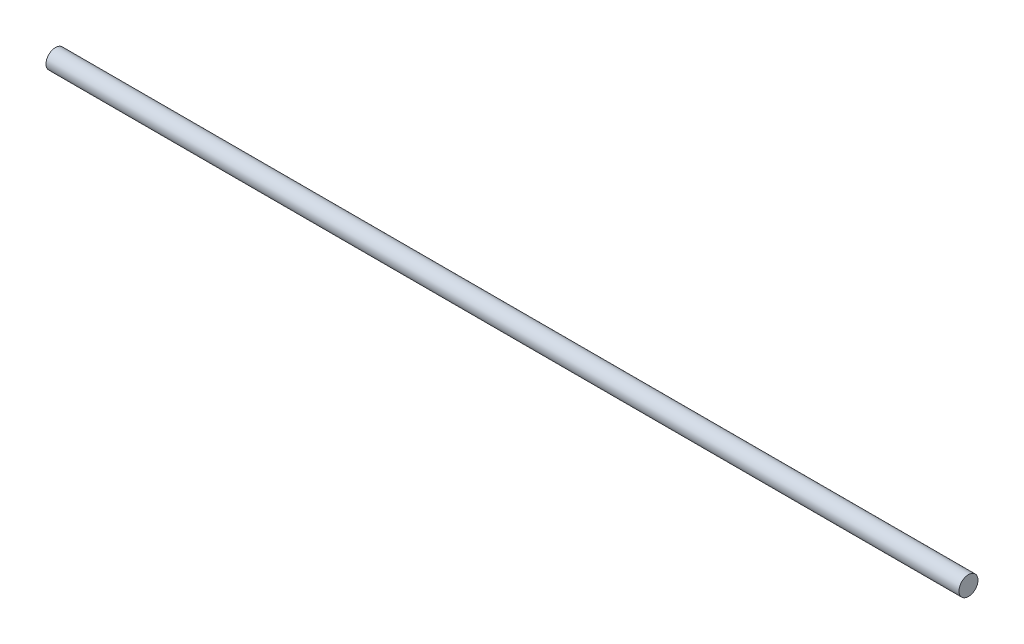
ISO-10303-21;
HEADER;
FILE_DESCRIPTION(('STEP AP214'),'2;1');
FILE_NAME('part.step','',(''),(''),'','','');
FILE_SCHEMA(('AUTOMOTIVE_DESIGN { 1 0 10303 214 1 1 1 1 }'));
ENDSEC;
DATA;
#1=APPLICATION_CONTEXT('core data for automotive mechanical design processes');
#2=APPLICATION_PROTOCOL_DEFINITION('international standard','automotive_design',2000,#1);
#3=PRODUCT_CONTEXT('',#1,'mechanical');
#4=PRODUCT('Part','Part','',(#3));
#5=PRODUCT_RELATED_PRODUCT_CATEGORY('part','',(#4));
#6=PRODUCT_DEFINITION_FORMATION('','',#4);
#7=PRODUCT_DEFINITION_CONTEXT('part definition',#1,'design');
#8=PRODUCT_DEFINITION('design','',#6,#7);
#9=PRODUCT_DEFINITION_SHAPE('','',#8);
#10=(LENGTH_UNIT() NAMED_UNIT(*) SI_UNIT(.MILLI.,.METRE.));
#11=(NAMED_UNIT(*) PLANE_ANGLE_UNIT() SI_UNIT($,.RADIAN.));
#12=(NAMED_UNIT(*) SI_UNIT($,.STERADIAN.) SOLID_ANGLE_UNIT());
#13=UNCERTAINTY_MEASURE_WITH_UNIT(LENGTH_MEASURE(1.E-05),#10,'distance_accuracy_value','');
#14=(GEOMETRIC_REPRESENTATION_CONTEXT(3) GLOBAL_UNCERTAINTY_ASSIGNED_CONTEXT((#13)) GLOBAL_UNIT_ASSIGNED_CONTEXT((#10,
#11,#12)) REPRESENTATION_CONTEXT('',''));
#15=CARTESIAN_POINT('',(0.,0.,0.));
#16=DIRECTION('',(0.,0.,1.));
#17=DIRECTION('',(1.,0.,0.));
#18=AXIS2_PLACEMENT_3D('',#15,#16,#17);
#19=CARTESIAN_POINT('',(-182.88,0.,0.));
#20=DIRECTION('',(1.,0.,0.));
#21=DIRECTION('',(0.,0.,-1.));
#22=AXIS2_PLACEMENT_3D('',#19,#20,#21);
#23=CYLINDRICAL_SURFACE('',#22,3.81);
#24=CARTESIAN_POINT('',(-182.88,0.,0.));
#25=DIRECTION('',(1.,0.,0.));
#26=DIRECTION('',(0.,0.,-1.));
#27=AXIS2_PLACEMENT_3D('',#24,#25,#26);
#28=CIRCLE('',#27,3.81);
#29=CARTESIAN_POINT('',(-182.88,0.,-3.81));
#30=VERTEX_POINT('',#29);
#31=EDGE_CURVE('E10',#30,#30,#28,.T.);
#32=ORIENTED_EDGE('',*,*,#31,.T.);
#33=EDGE_LOOP('',(#32));
#34=FACE_BOUND('',#33,.T.);
#35=CARTESIAN_POINT('',(182.88,0.,0.));
#36=DIRECTION('',(1.,0.,0.));
#37=DIRECTION('',(0.,0.,-1.));
#38=AXIS2_PLACEMENT_3D('',#35,#36,#37);
#39=CIRCLE('',#38,3.81);
#40=CARTESIAN_POINT('',(182.88,0.,-3.81));
#41=VERTEX_POINT('',#40);
#42=EDGE_CURVE('E36',#41,#41,#39,.T.);
#43=ORIENTED_EDGE('',*,*,#42,.F.);
#44=EDGE_LOOP('',(#43));
#45=FACE_BOUND('',#44,.T.);
#46=ADVANCED_FACE('F30',(#34,#45),#23,.T.);
#47=CARTESIAN_POINT('',(-182.88,0.,0.));
#48=DIRECTION('',(1.,0.,0.));
#49=DIRECTION('',(0.,0.,-1.));
#50=AXIS2_PLACEMENT_3D('',#47,#48,#49);
#51=PLANE('',#50);
#52=ORIENTED_EDGE('',*,*,#31,.F.);
#53=EDGE_LOOP('',(#52));
#54=FACE_BOUND('',#53,.T.);
#55=ADVANCED_FACE('F45',(#54),#51,.F.);
#56=CARTESIAN_POINT('',(182.88,0.,0.));
#57=DIRECTION('',(1.,0.,0.));
#58=DIRECTION('',(0.,0.,-1.));
#59=AXIS2_PLACEMENT_3D('',#56,#57,#58);
#60=PLANE('',#59);
#61=ORIENTED_EDGE('',*,*,#42,.T.);
#62=EDGE_LOOP('',(#61));
#63=FACE_BOUND('',#62,.T.);
#64=ADVANCED_FACE('F42',(#63),#60,.T.);
#65=CLOSED_SHELL('',(#46,#55,#64));
#66=MANIFOLD_SOLID_BREP('B2',#65);
#67=ADVANCED_BREP_SHAPE_REPRESENTATION('',(#18,#66),#14);
#68=SHAPE_DEFINITION_REPRESENTATION(#9,#67);
ENDSEC;
END-ISO-10303-21;
